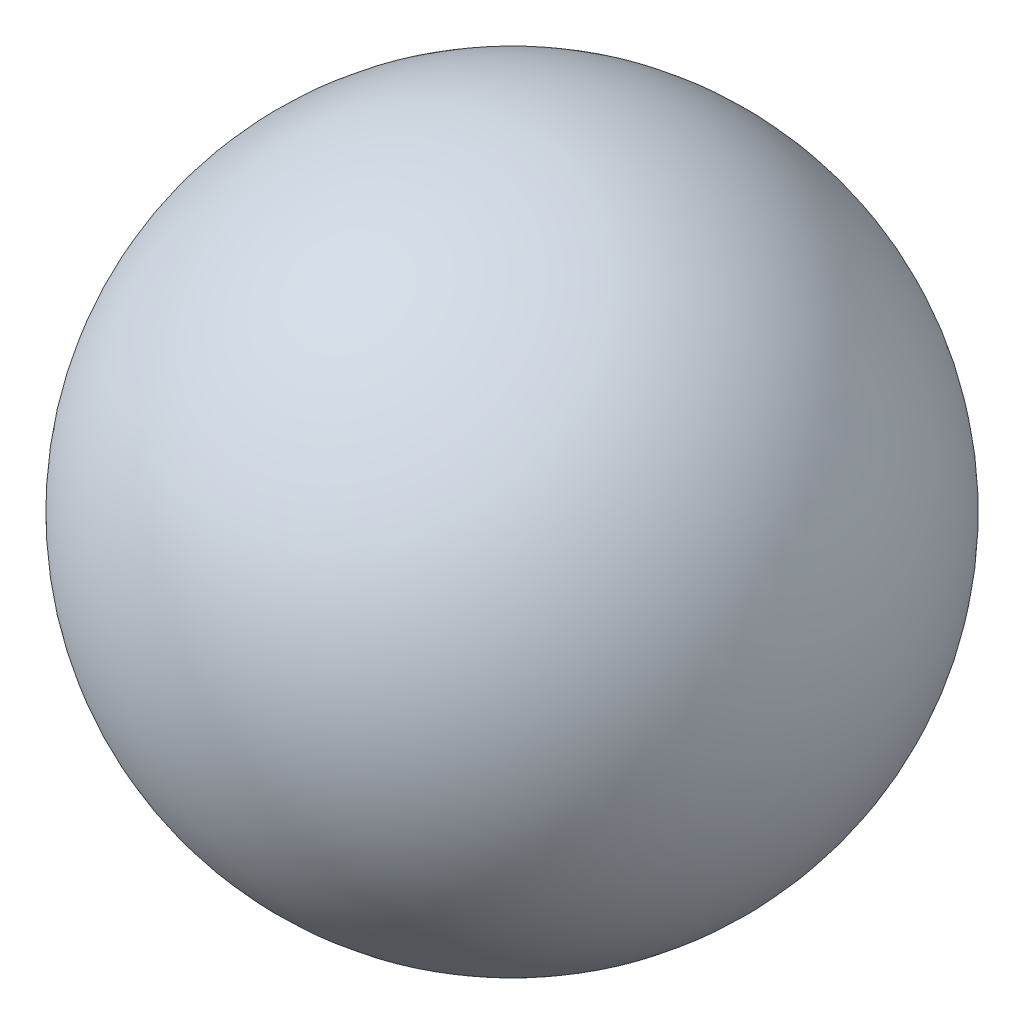
ISO-10303-21;
HEADER;
FILE_DESCRIPTION(('STEP AP214'),'2;1');
FILE_NAME('part.step','',(''),(''),'','','');
FILE_SCHEMA(('AUTOMOTIVE_DESIGN { 1 0 10303 214 1 1 1 1 }'));
ENDSEC;
DATA;
#1=APPLICATION_CONTEXT('core data for automotive mechanical design processes');
#2=APPLICATION_PROTOCOL_DEFINITION('international standard','automotive_design',2000,#1);
#3=PRODUCT_CONTEXT('',#1,'mechanical');
#4=PRODUCT('Part','Part','',(#3));
#5=PRODUCT_RELATED_PRODUCT_CATEGORY('part','',(#4));
#6=PRODUCT_DEFINITION_FORMATION('','',#4);
#7=PRODUCT_DEFINITION_CONTEXT('part definition',#1,'design');
#8=PRODUCT_DEFINITION('design','',#6,#7);
#9=PRODUCT_DEFINITION_SHAPE('','',#8);
#10=(LENGTH_UNIT() NAMED_UNIT(*) SI_UNIT(.MILLI.,.METRE.));
#11=(NAMED_UNIT(*) PLANE_ANGLE_UNIT() SI_UNIT($,.RADIAN.));
#12=(NAMED_UNIT(*) SI_UNIT($,.STERADIAN.) SOLID_ANGLE_UNIT());
#13=UNCERTAINTY_MEASURE_WITH_UNIT(LENGTH_MEASURE(1.E-05),#10,'distance_accuracy_value','');
#14=(GEOMETRIC_REPRESENTATION_CONTEXT(3) GLOBAL_UNCERTAINTY_ASSIGNED_CONTEXT((#13)) GLOBAL_UNIT_ASSIGNED_CONTEXT((#10,
#11,#12)) REPRESENTATION_CONTEXT('',''));
#15=CARTESIAN_POINT('',(0.,0.,0.));
#16=DIRECTION('',(0.,0.,1.));
#17=DIRECTION('',(1.,0.,0.));
#18=AXIS2_PLACEMENT_3D('',#15,#16,#17);
#19=CARTESIAN_POINT('',(0.,0.,0.));
#20=DIRECTION('',(0.,1.,0.));
#21=DIRECTION('',(1.,0.,0.));
#22=AXIS2_PLACEMENT_3D('',#19,#20,#21);
#23=SPHERICAL_SURFACE('',#22,88.9);
#24=CARTESIAN_POINT('',(0.,88.9,0.));
#25=VERTEX_POINT('',#24);
#26=VERTEX_LOOP('',#25);
#27=FACE_BOUND('',#26,.T.);
#28=ADVANCED_FACE('F43',(#27),#23,.T.);
#29=CLOSED_SHELL('',(#28));
#30=MANIFOLD_SOLID_BREP('B2',#29);
#31=ADVANCED_BREP_SHAPE_REPRESENTATION('',(#18,#30),#14);
#32=SHAPE_DEFINITION_REPRESENTATION(#9,#31);
ENDSEC;
END-ISO-10303-21;
